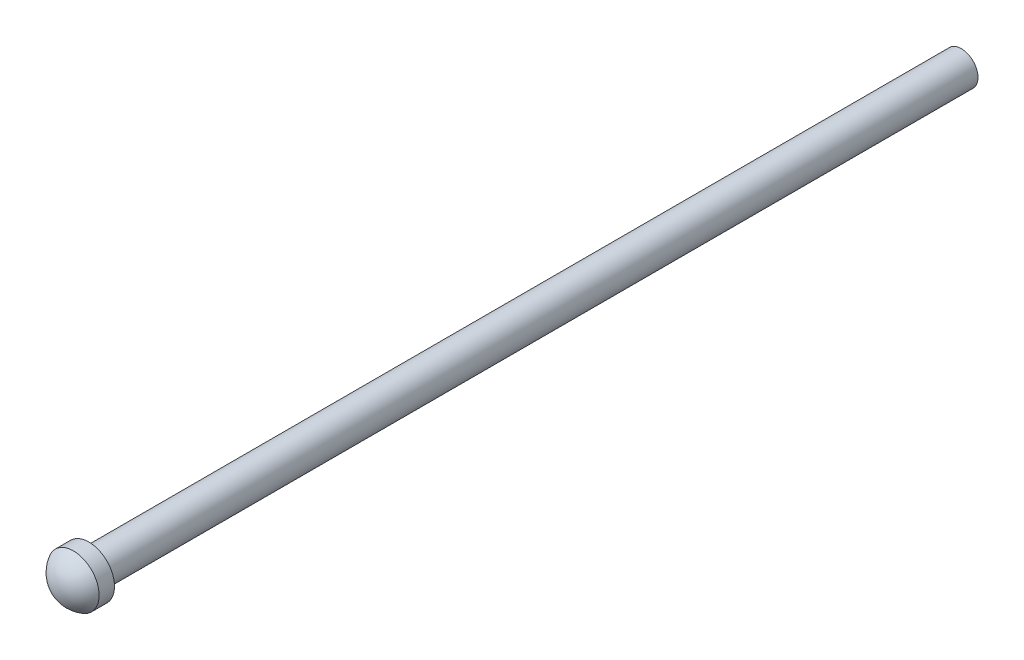
ISO-10303-21;
HEADER;
FILE_DESCRIPTION(('STEP AP214'),'2;1');
FILE_NAME('part.step','',(''),(''),'','','');
FILE_SCHEMA(('AUTOMOTIVE_DESIGN { 1 0 10303 214 1 1 1 1 }'));
ENDSEC;
DATA;
#1=APPLICATION_CONTEXT('core data for automotive mechanical design processes');
#2=APPLICATION_PROTOCOL_DEFINITION('international standard','automotive_design',2000,#1);
#3=PRODUCT_CONTEXT('',#1,'mechanical');
#4=PRODUCT('Part','Part','',(#3));
#5=PRODUCT_RELATED_PRODUCT_CATEGORY('part','',(#4));
#6=PRODUCT_DEFINITION_FORMATION('','',#4);
#7=PRODUCT_DEFINITION_CONTEXT('part definition',#1,'design');
#8=PRODUCT_DEFINITION('design','',#6,#7);
#9=PRODUCT_DEFINITION_SHAPE('','',#8);
#10=(LENGTH_UNIT() NAMED_UNIT(*) SI_UNIT(.MILLI.,.METRE.));
#11=(NAMED_UNIT(*) PLANE_ANGLE_UNIT() SI_UNIT($,.RADIAN.));
#12=(NAMED_UNIT(*) SI_UNIT($,.STERADIAN.) SOLID_ANGLE_UNIT());
#13=UNCERTAINTY_MEASURE_WITH_UNIT(LENGTH_MEASURE(1.E-05),#10,'distance_accuracy_value','');
#14=(GEOMETRIC_REPRESENTATION_CONTEXT(3) GLOBAL_UNCERTAINTY_ASSIGNED_CONTEXT((#13)) GLOBAL_UNIT_ASSIGNED_CONTEXT((#10,
#11,#12)) REPRESENTATION_CONTEXT('',''));
#15=CARTESIAN_POINT('',(0.,0.,0.));
#16=DIRECTION('',(0.,0.,1.));
#17=DIRECTION('',(1.,0.,0.));
#18=AXIS2_PLACEMENT_3D('',#15,#16,#17);
#19=CARTESIAN_POINT('',(5.,60.,-170.));
#20=DIRECTION('',(0.,0.,1.));
#21=DIRECTION('',(1.,0.,0.));
#22=AXIS2_PLACEMENT_3D('',#19,#20,#21);
#23=CYLINDRICAL_SURFACE('',#22,3.25);
#24=CARTESIAN_POINT('',(5.,60.,-170.));
#25=DIRECTION('',(0.,0.,1.));
#26=DIRECTION('',(1.,0.,0.));
#27=AXIS2_PLACEMENT_3D('',#24,#25,#26);
#28=CIRCLE('',#27,3.25);
#29=CARTESIAN_POINT('',(8.25,60.,-170.));
#30=VERTEX_POINT('',#29);
#31=EDGE_CURVE('E10',#30,#30,#28,.T.);
#32=ORIENTED_EDGE('',*,*,#31,.T.);
#33=EDGE_LOOP('',(#32));
#34=FACE_BOUND('',#33,.T.);
#35=CARTESIAN_POINT('',(5.,60.,0.));
#36=DIRECTION('',(0.,0.,1.));
#37=DIRECTION('',(1.,0.,0.));
#38=AXIS2_PLACEMENT_3D('',#35,#36,#37);
#39=CIRCLE('',#38,3.25);
#40=CARTESIAN_POINT('',(8.25,60.,0.));
#41=VERTEX_POINT('',#40);
#42=EDGE_CURVE('E39',#41,#41,#39,.T.);
#43=ORIENTED_EDGE('',*,*,#42,.F.);
#44=EDGE_LOOP('',(#43));
#45=FACE_BOUND('',#44,.T.);
#46=ADVANCED_FACE('F31',(#34,#45),#23,.T.);
#47=CARTESIAN_POINT('',(5.,60.,-170.));
#48=DIRECTION('',(0.,0.,1.));
#49=DIRECTION('',(1.,0.,0.));
#50=AXIS2_PLACEMENT_3D('',#47,#48,#49);
#51=PLANE('',#50);
#52=ORIENTED_EDGE('',*,*,#31,.F.);
#53=EDGE_LOOP('',(#52));
#54=FACE_BOUND('',#53,.T.);
#55=ADVANCED_FACE('F55',(#54),#51,.F.);
#56=CARTESIAN_POINT('',(5.,60.,3.));
#57=DIRECTION('',(0.,0.,-1.));
#58=DIRECTION('',(-1.,0.,0.));
#59=AXIS2_PLACEMENT_3D('',#56,#57,#58);
#60=CYLINDRICAL_SURFACE('',#59,5.);
#61=CARTESIAN_POINT('',(5.,60.,3.));
#62=DIRECTION('',(0.,0.,1.));
#63=DIRECTION('',(1.,0.,0.));
#64=AXIS2_PLACEMENT_3D('',#61,#62,#63);
#65=CIRCLE('',#64,5.);
#66=CARTESIAN_POINT('',(10.,60.,3.));
#67=VERTEX_POINT('',#66);
#68=EDGE_CURVE('E35',#67,#67,#65,.T.);
#69=ORIENTED_EDGE('',*,*,#68,.F.);
#70=EDGE_LOOP('',(#69));
#71=FACE_BOUND('',#70,.T.);
#72=CARTESIAN_POINT('',(5.,60.,0.));
#73=DIRECTION('',(0.,0.,1.));
#74=DIRECTION('',(1.,0.,0.));
#75=AXIS2_PLACEMENT_3D('',#72,#73,#74);
#76=CIRCLE('',#75,5.);
#77=CARTESIAN_POINT('',(10.,60.,0.));
#78=VERTEX_POINT('',#77);
#79=EDGE_CURVE('E45',#78,#78,#76,.T.);
#80=ORIENTED_EDGE('',*,*,#79,.T.);
#81=EDGE_LOOP('',(#80));
#82=FACE_BOUND('',#81,.T.);
#83=ADVANCED_FACE('F53',(#71,#82),#60,.T.);
#84=CARTESIAN_POINT('',(5.,60.,0.333333333333338));
#85=DIRECTION('',(0.,0.,1.));
#86=DIRECTION('',(1.,0.,0.));
#87=AXIS2_PLACEMENT_3D('',#84,#85,#86);
#88=SPHERICAL_SURFACE('',#87,5.66666666666666);
#89=ORIENTED_EDGE('',*,*,#68,.T.);
#90=EDGE_LOOP('',(#89));
#91=FACE_BOUND('',#90,.T.);
#92=ADVANCED_FACE('F33',(#91),#88,.T.);
#93=CARTESIAN_POINT('',(5.,60.,0.));
#94=DIRECTION('',(0.,0.,1.));
#95=DIRECTION('',(1.,0.,0.));
#96=AXIS2_PLACEMENT_3D('',#93,#94,#95);
#97=PLANE('',#96);
#98=ORIENTED_EDGE('',*,*,#42,.T.);
#99=EDGE_LOOP('',(#98));
#100=FACE_BOUND('',#99,.T.);
#101=ORIENTED_EDGE('',*,*,#79,.F.);
#102=EDGE_LOOP('',(#101));
#103=FACE_BOUND('',#102,.T.);
#104=ADVANCED_FACE('F61',(#100,#103),#97,.F.);
#105=CLOSED_SHELL('',(#46,#55,#83,#92,#104));
#106=MANIFOLD_SOLID_BREP('B2',#105);
#107=ADVANCED_BREP_SHAPE_REPRESENTATION('',(#18,#106),#14);
#108=SHAPE_DEFINITION_REPRESENTATION(#9,#107);
ENDSEC;
END-ISO-10303-21;
